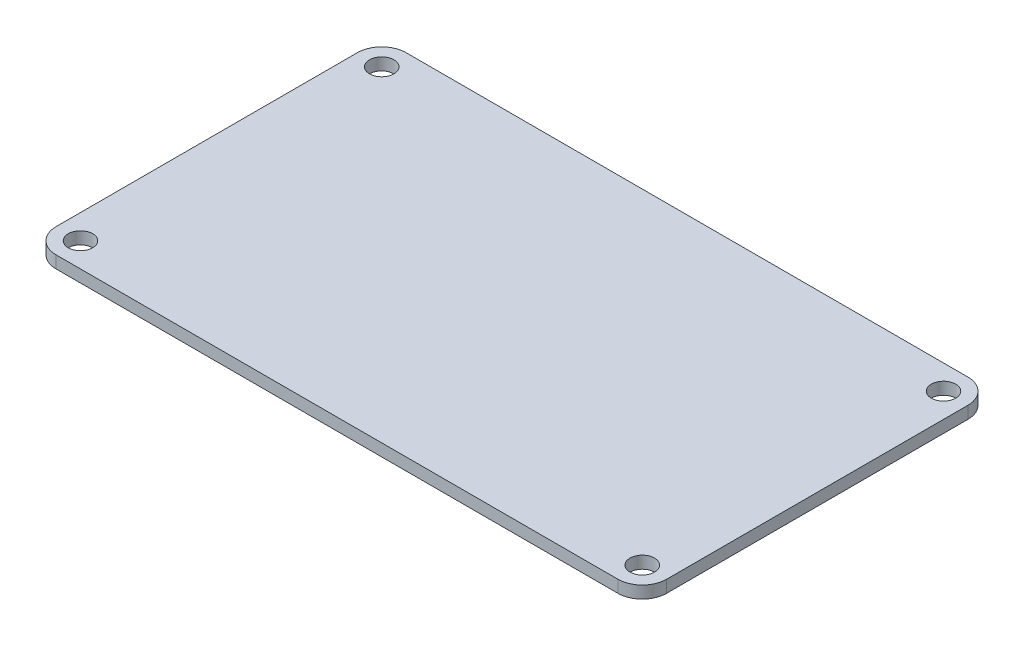
ISO-10303-21;
HEADER;
FILE_DESCRIPTION(('STEP AP214'),'2;1');
FILE_NAME('part.step','',(''),(''),'','','');
FILE_SCHEMA(('AUTOMOTIVE_DESIGN { 1 0 10303 214 1 1 1 1 }'));
ENDSEC;
DATA;
#1=APPLICATION_CONTEXT('core data for automotive mechanical design processes');
#2=APPLICATION_PROTOCOL_DEFINITION('international standard','automotive_design',2000,#1);
#3=PRODUCT_CONTEXT('',#1,'mechanical');
#4=PRODUCT('Part','Part','',(#3));
#5=PRODUCT_RELATED_PRODUCT_CATEGORY('part','',(#4));
#6=PRODUCT_DEFINITION_FORMATION('','',#4);
#7=PRODUCT_DEFINITION_CONTEXT('part definition',#1,'design');
#8=PRODUCT_DEFINITION('design','',#6,#7);
#9=PRODUCT_DEFINITION_SHAPE('','',#8);
#10=(LENGTH_UNIT() NAMED_UNIT(*) SI_UNIT(.MILLI.,.METRE.));
#11=(NAMED_UNIT(*) PLANE_ANGLE_UNIT() SI_UNIT($,.RADIAN.));
#12=(NAMED_UNIT(*) SI_UNIT($,.STERADIAN.) SOLID_ANGLE_UNIT());
#13=UNCERTAINTY_MEASURE_WITH_UNIT(LENGTH_MEASURE(1.E-05),#10,'distance_accuracy_value','');
#14=(GEOMETRIC_REPRESENTATION_CONTEXT(3) GLOBAL_UNCERTAINTY_ASSIGNED_CONTEXT((#13)) GLOBAL_UNIT_ASSIGNED_CONTEXT((#10,
#11,#12)) REPRESENTATION_CONTEXT('',''));
#15=CARTESIAN_POINT('',(0.,0.,0.));
#16=DIRECTION('',(0.,0.,1.));
#17=DIRECTION('',(1.,0.,0.));
#18=AXIS2_PLACEMENT_3D('',#15,#16,#17);
#19=CARTESIAN_POINT('',(34.5,1.5,18.5));
#20=DIRECTION('',(0.,1.,0.));
#21=DIRECTION('',(0.,0.,1.));
#22=AXIS2_PLACEMENT_3D('',#19,#20,#21);
#23=PLANE('',#22);
#24=CARTESIAN_POINT('',(-34.5,1.5,18.5));
#25=DIRECTION('',(0.,1.,0.));
#26=DIRECTION('',(0.,0.,1.));
#27=AXIS2_PLACEMENT_3D('',#24,#25,#26);
#28=CIRCLE('',#27,1.5);
#29=CARTESIAN_POINT('',(-34.5,1.5,20.));
#30=VERTEX_POINT('',#29);
#31=EDGE_CURVE('E191',#30,#30,#28,.T.);
#32=ORIENTED_EDGE('',*,*,#31,.F.);
#33=EDGE_LOOP('',(#32));
#34=FACE_BOUND('',#33,.T.);
#35=CARTESIAN_POINT('',(34.5,1.5,-18.5));
#36=DIRECTION('',(0.,1.,0.));
#37=DIRECTION('',(0.,0.,1.));
#38=AXIS2_PLACEMENT_3D('',#35,#36,#37);
#39=CIRCLE('',#38,1.5);
#40=CARTESIAN_POINT('',(34.5,1.5,-17.));
#41=VERTEX_POINT('',#40);
#42=EDGE_CURVE('E137',#41,#41,#39,.T.);
#43=ORIENTED_EDGE('',*,*,#42,.F.);
#44=EDGE_LOOP('',(#43));
#45=FACE_BOUND('',#44,.T.);
#46=CARTESIAN_POINT('',(34.5,1.5,18.5));
#47=DIRECTION('',(0.,1.,0.));
#48=DIRECTION('',(0.,0.,1.));
#49=AXIS2_PLACEMENT_3D('',#46,#47,#48);
#50=CIRCLE('',#49,3.);
#51=CARTESIAN_POINT('',(34.5,1.5,21.5));
#52=VERTEX_POINT('',#51);
#53=CARTESIAN_POINT('',(37.5,1.5,18.5));
#54=VERTEX_POINT('',#53);
#55=EDGE_CURVE('E148',#52,#54,#50,.T.);
#56=ORIENTED_EDGE('',*,*,#55,.T.);
#57=DIRECTION('',(0.,0.,-1.));
#58=VECTOR('',#57,1.);
#59=CARTESIAN_POINT('',(37.5,1.5,18.5));
#60=LINE('',#59,#58);
#61=CARTESIAN_POINT('',(37.5,1.5,-18.5));
#62=VERTEX_POINT('',#61);
#63=EDGE_CURVE('E96',#54,#62,#60,.T.);
#64=ORIENTED_EDGE('',*,*,#63,.T.);
#65=CARTESIAN_POINT('',(34.5,1.5,-18.5));
#66=DIRECTION('',(0.,1.,0.));
#67=DIRECTION('',(0.,0.,1.));
#68=AXIS2_PLACEMENT_3D('',#65,#66,#67);
#69=CIRCLE('',#68,3.);
#70=CARTESIAN_POINT('',(34.5,1.5,-21.5));
#71=VERTEX_POINT('',#70);
#72=EDGE_CURVE('E163',#62,#71,#69,.T.);
#73=ORIENTED_EDGE('',*,*,#72,.T.);
#74=DIRECTION('',(-1.,0.,0.));
#75=VECTOR('',#74,1.);
#76=CARTESIAN_POINT('',(34.5,1.5,-21.5));
#77=LINE('',#76,#75);
#78=CARTESIAN_POINT('',(-34.5,1.5,-21.5));
#79=VERTEX_POINT('',#78);
#80=EDGE_CURVE('E176',#71,#79,#77,.T.);
#81=ORIENTED_EDGE('',*,*,#80,.T.);
#82=CARTESIAN_POINT('',(-34.5,1.5,-18.5));
#83=DIRECTION('',(0.,1.,0.));
#84=DIRECTION('',(0.,0.,1.));
#85=AXIS2_PLACEMENT_3D('',#82,#83,#84);
#86=CIRCLE('',#85,3.);
#87=CARTESIAN_POINT('',(-37.5,1.5,-18.5));
#88=VERTEX_POINT('',#87);
#89=EDGE_CURVE('E115',#79,#88,#86,.T.);
#90=ORIENTED_EDGE('',*,*,#89,.T.);
#91=DIRECTION('',(0.,0.,1.));
#92=VECTOR('',#91,1.);
#93=CARTESIAN_POINT('',(-37.5,1.5,18.5));
#94=LINE('',#93,#92);
#95=CARTESIAN_POINT('',(-37.5,1.5,18.5));
#96=VERTEX_POINT('',#95);
#97=EDGE_CURVE('E109',#88,#96,#94,.T.);
#98=ORIENTED_EDGE('',*,*,#97,.T.);
#99=CARTESIAN_POINT('',(-34.5,1.5,18.5));
#100=DIRECTION('',(0.,1.,0.));
#101=DIRECTION('',(0.,0.,-1.));
#102=AXIS2_PLACEMENT_3D('',#99,#100,#101);
#103=CIRCLE('',#102,3.);
#104=CARTESIAN_POINT('',(-34.5,1.5,21.5));
#105=VERTEX_POINT('',#104);
#106=EDGE_CURVE('E113',#96,#105,#103,.T.);
#107=ORIENTED_EDGE('',*,*,#106,.T.);
#108=DIRECTION('',(1.,0.,0.));
#109=VECTOR('',#108,1.);
#110=CARTESIAN_POINT('',(34.5,1.5,21.5));
#111=LINE('',#110,#109);
#112=EDGE_CURVE('E53',#105,#52,#111,.T.);
#113=ORIENTED_EDGE('',*,*,#112,.T.);
#114=EDGE_LOOP('',(#56,#64,#73,#81,#90,#98,#107,#113));
#115=FACE_BOUND('',#114,.T.);
#116=CARTESIAN_POINT('',(-34.5,1.5,-18.5));
#117=DIRECTION('',(0.,1.,0.));
#118=DIRECTION('',(0.,0.,1.));
#119=AXIS2_PLACEMENT_3D('',#116,#117,#118);
#120=CIRCLE('',#119,1.5);
#121=CARTESIAN_POINT('',(-34.5,1.5,-17.));
#122=VERTEX_POINT('',#121);
#123=EDGE_CURVE('E185',#122,#122,#120,.T.);
#124=ORIENTED_EDGE('',*,*,#123,.F.);
#125=EDGE_LOOP('',(#124));
#126=FACE_BOUND('',#125,.T.);
#127=CARTESIAN_POINT('',(34.5,1.5,18.5));
#128=DIRECTION('',(0.,1.,0.));
#129=DIRECTION('',(0.,0.,1.));
#130=AXIS2_PLACEMENT_3D('',#127,#128,#129);
#131=CIRCLE('',#130,1.5);
#132=CARTESIAN_POINT('',(34.5,1.5,20.));
#133=VERTEX_POINT('',#132);
#134=EDGE_CURVE('E197',#133,#133,#131,.T.);
#135=ORIENTED_EDGE('',*,*,#134,.F.);
#136=EDGE_LOOP('',(#135));
#137=FACE_BOUND('',#136,.T.);
#138=ADVANCED_FACE('F36',(#34,#45,#115,#126,#137),#23,.T.);
#139=CARTESIAN_POINT('',(34.5,0.,18.5));
#140=DIRECTION('',(0.,1.,0.));
#141=DIRECTION('',(0.,0.,1.));
#142=AXIS2_PLACEMENT_3D('',#139,#140,#141);
#143=PLANE('',#142);
#144=CARTESIAN_POINT('',(34.5,0.,18.5));
#145=DIRECTION('',(0.,1.,0.));
#146=DIRECTION('',(0.,0.,1.));
#147=AXIS2_PLACEMENT_3D('',#144,#145,#146);
#148=CIRCLE('',#147,3.);
#149=CARTESIAN_POINT('',(34.5,0.,21.5));
#150=VERTEX_POINT('',#149);
#151=CARTESIAN_POINT('',(37.5,0.,18.5));
#152=VERTEX_POINT('',#151);
#153=EDGE_CURVE('E133',#150,#152,#148,.T.);
#154=ORIENTED_EDGE('',*,*,#153,.F.);
#155=DIRECTION('',(1.,0.,0.));
#156=VECTOR('',#155,1.);
#157=CARTESIAN_POINT('',(34.5,0.,21.5));
#158=LINE('',#157,#156);
#159=CARTESIAN_POINT('',(-34.5,0.,21.5));
#160=VERTEX_POINT('',#159);
#161=EDGE_CURVE('E88',#160,#150,#158,.T.);
#162=ORIENTED_EDGE('',*,*,#161,.F.);
#163=CARTESIAN_POINT('',(-34.5,0.,18.5));
#164=DIRECTION('',(0.,1.,0.));
#165=DIRECTION('',(0.,0.,-1.));
#166=AXIS2_PLACEMENT_3D('',#163,#164,#165);
#167=CIRCLE('',#166,3.);
#168=CARTESIAN_POINT('',(-37.5,0.,18.5));
#169=VERTEX_POINT('',#168);
#170=EDGE_CURVE('E82',#169,#160,#167,.T.);
#171=ORIENTED_EDGE('',*,*,#170,.F.);
#172=DIRECTION('',(0.,0.,1.));
#173=VECTOR('',#172,1.);
#174=CARTESIAN_POINT('',(-37.5,0.,18.5));
#175=LINE('',#174,#173);
#176=CARTESIAN_POINT('',(-37.5,0.,-18.5));
#177=VERTEX_POINT('',#176);
#178=EDGE_CURVE('E123',#177,#169,#175,.T.);
#179=ORIENTED_EDGE('',*,*,#178,.F.);
#180=CARTESIAN_POINT('',(-34.5,0.,-18.5));
#181=DIRECTION('',(0.,1.,0.));
#182=DIRECTION('',(0.,0.,1.));
#183=AXIS2_PLACEMENT_3D('',#180,#181,#182);
#184=CIRCLE('',#183,3.);
#185=CARTESIAN_POINT('',(-34.5,0.,-21.5));
#186=VERTEX_POINT('',#185);
#187=EDGE_CURVE('E143',#186,#177,#184,.T.);
#188=ORIENTED_EDGE('',*,*,#187,.F.);
#189=DIRECTION('',(-1.,0.,0.));
#190=VECTOR('',#189,1.);
#191=CARTESIAN_POINT('',(34.5,0.,-21.5));
#192=LINE('',#191,#190);
#193=CARTESIAN_POINT('',(34.5,0.,-21.5));
#194=VERTEX_POINT('',#193);
#195=EDGE_CURVE('E141',#194,#186,#192,.T.);
#196=ORIENTED_EDGE('',*,*,#195,.F.);
#197=CARTESIAN_POINT('',(34.5,0.,-18.5));
#198=DIRECTION('',(0.,1.,0.));
#199=DIRECTION('',(0.,0.,1.));
#200=AXIS2_PLACEMENT_3D('',#197,#198,#199);
#201=CIRCLE('',#200,3.);
#202=CARTESIAN_POINT('',(37.5,0.,-18.5));
#203=VERTEX_POINT('',#202);
#204=EDGE_CURVE('E139',#203,#194,#201,.T.);
#205=ORIENTED_EDGE('',*,*,#204,.F.);
#206=DIRECTION('',(0.,0.,-1.));
#207=VECTOR('',#206,1.);
#208=CARTESIAN_POINT('',(37.5,0.,18.5));
#209=LINE('',#208,#207);
#210=EDGE_CURVE('E136',#152,#203,#209,.T.);
#211=ORIENTED_EDGE('',*,*,#210,.F.);
#212=EDGE_LOOP('',(#154,#162,#171,#179,#188,#196,#205,#211));
#213=FACE_BOUND('',#212,.T.);
#214=CARTESIAN_POINT('',(34.5,0.,-18.5));
#215=DIRECTION('',(0.,1.,0.));
#216=DIRECTION('',(0.,0.,1.));
#217=AXIS2_PLACEMENT_3D('',#214,#215,#216);
#218=CIRCLE('',#217,1.5);
#219=CARTESIAN_POINT('',(34.5,0.,-17.));
#220=VERTEX_POINT('',#219);
#221=EDGE_CURVE('E182',#220,#220,#218,.T.);
#222=ORIENTED_EDGE('',*,*,#221,.T.);
#223=EDGE_LOOP('',(#222));
#224=FACE_BOUND('',#223,.T.);
#225=CARTESIAN_POINT('',(-34.5,0.,-18.5));
#226=DIRECTION('',(0.,1.,0.));
#227=DIRECTION('',(0.,0.,1.));
#228=AXIS2_PLACEMENT_3D('',#225,#226,#227);
#229=CIRCLE('',#228,1.5);
#230=CARTESIAN_POINT('',(-34.5,0.,-17.));
#231=VERTEX_POINT('',#230);
#232=EDGE_CURVE('E188',#231,#231,#229,.T.);
#233=ORIENTED_EDGE('',*,*,#232,.T.);
#234=EDGE_LOOP('',(#233));
#235=FACE_BOUND('',#234,.T.);
#236=CARTESIAN_POINT('',(-34.5,0.,18.5));
#237=DIRECTION('',(0.,1.,0.));
#238=DIRECTION('',(0.,0.,1.));
#239=AXIS2_PLACEMENT_3D('',#236,#237,#238);
#240=CIRCLE('',#239,1.5);
#241=CARTESIAN_POINT('',(-34.5,0.,20.));
#242=VERTEX_POINT('',#241);
#243=EDGE_CURVE('E194',#242,#242,#240,.T.);
#244=ORIENTED_EDGE('',*,*,#243,.T.);
#245=EDGE_LOOP('',(#244));
#246=FACE_BOUND('',#245,.T.);
#247=CARTESIAN_POINT('',(34.5,0.,18.5));
#248=DIRECTION('',(0.,1.,0.));
#249=DIRECTION('',(0.,0.,1.));
#250=AXIS2_PLACEMENT_3D('',#247,#248,#249);
#251=CIRCLE('',#250,1.5);
#252=CARTESIAN_POINT('',(34.5,0.,20.));
#253=VERTEX_POINT('',#252);
#254=EDGE_CURVE('E200',#253,#253,#251,.T.);
#255=ORIENTED_EDGE('',*,*,#254,.T.);
#256=EDGE_LOOP('',(#255));
#257=FACE_BOUND('',#256,.T.);
#258=ADVANCED_FACE('F167',(#213,#224,#235,#246,#257),#143,.F.);
#259=CARTESIAN_POINT('',(34.5,1.5,18.5));
#260=DIRECTION('',(0.,-1.,0.));
#261=DIRECTION('',(0.,0.,-1.));
#262=AXIS2_PLACEMENT_3D('',#259,#260,#261);
#263=CYLINDRICAL_SURFACE('',#262,3.);
#264=ORIENTED_EDGE('',*,*,#153,.T.);
#265=DIRECTION('',(0.,-1.,0.));
#266=VECTOR('',#265,1.);
#267=CARTESIAN_POINT('',(37.5,1.5,18.5));
#268=LINE('',#267,#266);
#269=EDGE_CURVE('E11',#54,#152,#268,.T.);
#270=ORIENTED_EDGE('',*,*,#269,.F.);
#271=ORIENTED_EDGE('',*,*,#55,.F.);
#272=DIRECTION('',(0.,-1.,0.));
#273=VECTOR('',#272,1.);
#274=CARTESIAN_POINT('',(34.5,1.5,21.5));
#275=LINE('',#274,#273);
#276=EDGE_CURVE('E129',#52,#150,#275,.T.);
#277=ORIENTED_EDGE('',*,*,#276,.T.);
#278=EDGE_LOOP('',(#264,#270,#271,#277));
#279=FACE_BOUND('',#278,.T.);
#280=ADVANCED_FACE('F38',(#279),#263,.T.);
#281=CARTESIAN_POINT('',(37.5,1.5,18.5));
#282=DIRECTION('',(-1.,0.,0.));
#283=DIRECTION('',(0.,0.,1.));
#284=AXIS2_PLACEMENT_3D('',#281,#282,#283);
#285=PLANE('',#284);
#286=ORIENTED_EDGE('',*,*,#210,.T.);
#287=DIRECTION('',(0.,-1.,0.));
#288=VECTOR('',#287,1.);
#289=CARTESIAN_POINT('',(37.5,1.5,-18.5));
#290=LINE('',#289,#288);
#291=EDGE_CURVE('E45',#62,#203,#290,.T.);
#292=ORIENTED_EDGE('',*,*,#291,.F.);
#293=ORIENTED_EDGE('',*,*,#63,.F.);
#294=ORIENTED_EDGE('',*,*,#269,.T.);
#295=EDGE_LOOP('',(#286,#292,#293,#294));
#296=FACE_BOUND('',#295,.T.);
#297=ADVANCED_FACE('F234',(#296),#285,.F.);
#298=CARTESIAN_POINT('',(34.5,1.5,-18.5));
#299=DIRECTION('',(0.,-1.,0.));
#300=DIRECTION('',(0.,0.,-1.));
#301=AXIS2_PLACEMENT_3D('',#298,#299,#300);
#302=CYLINDRICAL_SURFACE('',#301,3.);
#303=ORIENTED_EDGE('',*,*,#204,.T.);
#304=DIRECTION('',(0.,-1.,0.));
#305=VECTOR('',#304,1.);
#306=CARTESIAN_POINT('',(34.5,1.5,-21.5));
#307=LINE('',#306,#305);
#308=EDGE_CURVE('E155',#71,#194,#307,.T.);
#309=ORIENTED_EDGE('',*,*,#308,.F.);
#310=ORIENTED_EDGE('',*,*,#72,.F.);
#311=ORIENTED_EDGE('',*,*,#291,.T.);
#312=EDGE_LOOP('',(#303,#309,#310,#311));
#313=FACE_BOUND('',#312,.T.);
#314=ADVANCED_FACE('F161',(#313),#302,.T.);
#315=CARTESIAN_POINT('',(34.5,1.5,-21.5));
#316=DIRECTION('',(0.,0.,1.));
#317=DIRECTION('',(1.,0.,0.));
#318=AXIS2_PLACEMENT_3D('',#315,#316,#317);
#319=PLANE('',#318);
#320=ORIENTED_EDGE('',*,*,#195,.T.);
#321=DIRECTION('',(0.,-1.,0.));
#322=VECTOR('',#321,1.);
#323=CARTESIAN_POINT('',(-34.5,1.5,-21.5));
#324=LINE('',#323,#322);
#325=EDGE_CURVE('E152',#79,#186,#324,.T.);
#326=ORIENTED_EDGE('',*,*,#325,.F.);
#327=ORIENTED_EDGE('',*,*,#80,.F.);
#328=ORIENTED_EDGE('',*,*,#308,.T.);
#329=EDGE_LOOP('',(#320,#326,#327,#328));
#330=FACE_BOUND('',#329,.T.);
#331=ADVANCED_FACE('F172',(#330),#319,.F.);
#332=CARTESIAN_POINT('',(-34.5,1.5,-18.5));
#333=DIRECTION('',(0.,-1.,0.));
#334=DIRECTION('',(0.,0.,-1.));
#335=AXIS2_PLACEMENT_3D('',#332,#333,#334);
#336=CYLINDRICAL_SURFACE('',#335,3.);
#337=ORIENTED_EDGE('',*,*,#187,.T.);
#338=DIRECTION('',(0.,-1.,0.));
#339=VECTOR('',#338,1.);
#340=CARTESIAN_POINT('',(-37.5,1.5,-18.5));
#341=LINE('',#340,#339);
#342=EDGE_CURVE('E124',#88,#177,#341,.T.);
#343=ORIENTED_EDGE('',*,*,#342,.F.);
#344=ORIENTED_EDGE('',*,*,#89,.F.);
#345=ORIENTED_EDGE('',*,*,#325,.T.);
#346=EDGE_LOOP('',(#337,#343,#344,#345));
#347=FACE_BOUND('',#346,.T.);
#348=ADVANCED_FACE('F175',(#347),#336,.T.);
#349=CARTESIAN_POINT('',(-37.5,1.5,18.5));
#350=DIRECTION('',(1.,0.,0.));
#351=DIRECTION('',(0.,0.,-1.));
#352=AXIS2_PLACEMENT_3D('',#349,#350,#351);
#353=PLANE('',#352);
#354=ORIENTED_EDGE('',*,*,#178,.T.);
#355=DIRECTION('',(0.,-1.,0.));
#356=VECTOR('',#355,1.);
#357=CARTESIAN_POINT('',(-37.5,1.5,18.5));
#358=LINE('',#357,#356);
#359=EDGE_CURVE('E120',#96,#169,#358,.T.);
#360=ORIENTED_EDGE('',*,*,#359,.F.);
#361=ORIENTED_EDGE('',*,*,#97,.F.);
#362=ORIENTED_EDGE('',*,*,#342,.T.);
#363=EDGE_LOOP('',(#354,#360,#361,#362));
#364=FACE_BOUND('',#363,.T.);
#365=ADVANCED_FACE('F121',(#364),#353,.F.);
#366=CARTESIAN_POINT('',(-34.5,1.5,18.5));
#367=DIRECTION('',(0.,-1.,0.));
#368=DIRECTION('',(0.,0.,-1.));
#369=AXIS2_PLACEMENT_3D('',#366,#367,#368);
#370=CYLINDRICAL_SURFACE('',#369,3.);
#371=ORIENTED_EDGE('',*,*,#170,.T.);
#372=DIRECTION('',(0.,-1.,0.));
#373=VECTOR('',#372,1.);
#374=CARTESIAN_POINT('',(-34.5,1.5,21.5));
#375=LINE('',#374,#373);
#376=EDGE_CURVE('E125',#105,#160,#375,.T.);
#377=ORIENTED_EDGE('',*,*,#376,.F.);
#378=ORIENTED_EDGE('',*,*,#106,.F.);
#379=ORIENTED_EDGE('',*,*,#359,.T.);
#380=EDGE_LOOP('',(#371,#377,#378,#379));
#381=FACE_BOUND('',#380,.T.);
#382=ADVANCED_FACE('F127',(#381),#370,.T.);
#383=CARTESIAN_POINT('',(34.5,1.5,21.5));
#384=DIRECTION('',(0.,0.,-1.));
#385=DIRECTION('',(-1.,0.,0.));
#386=AXIS2_PLACEMENT_3D('',#383,#384,#385);
#387=PLANE('',#386);
#388=ORIENTED_EDGE('',*,*,#161,.T.);
#389=ORIENTED_EDGE('',*,*,#276,.F.);
#390=ORIENTED_EDGE('',*,*,#112,.F.);
#391=ORIENTED_EDGE('',*,*,#376,.T.);
#392=EDGE_LOOP('',(#388,#389,#390,#391));
#393=FACE_BOUND('',#392,.T.);
#394=ADVANCED_FACE('F222',(#393),#387,.F.);
#395=CARTESIAN_POINT('',(34.5,1.5,-18.5));
#396=DIRECTION('',(0.,-1.,0.));
#397=DIRECTION('',(0.,0.,-1.));
#398=AXIS2_PLACEMENT_3D('',#395,#396,#397);
#399=CYLINDRICAL_SURFACE('',#398,1.5);
#400=ORIENTED_EDGE('',*,*,#42,.T.);
#401=EDGE_LOOP('',(#400));
#402=FACE_BOUND('',#401,.T.);
#403=ORIENTED_EDGE('',*,*,#221,.F.);
#404=EDGE_LOOP('',(#403));
#405=FACE_BOUND('',#404,.T.);
#406=ADVANCED_FACE('F219',(#402,#405),#399,.F.);
#407=CARTESIAN_POINT('',(-34.5,1.5,-18.5));
#408=DIRECTION('',(0.,-1.,0.));
#409=DIRECTION('',(0.,0.,-1.));
#410=AXIS2_PLACEMENT_3D('',#407,#408,#409);
#411=CYLINDRICAL_SURFACE('',#410,1.5);
#412=ORIENTED_EDGE('',*,*,#123,.T.);
#413=EDGE_LOOP('',(#412));
#414=FACE_BOUND('',#413,.T.);
#415=ORIENTED_EDGE('',*,*,#232,.F.);
#416=EDGE_LOOP('',(#415));
#417=FACE_BOUND('',#416,.T.);
#418=ADVANCED_FACE('F298',(#414,#417),#411,.F.);
#419=CARTESIAN_POINT('',(-34.5,1.5,18.5));
#420=DIRECTION('',(0.,-1.,0.));
#421=DIRECTION('',(0.,0.,-1.));
#422=AXIS2_PLACEMENT_3D('',#419,#420,#421);
#423=CYLINDRICAL_SURFACE('',#422,1.5);
#424=ORIENTED_EDGE('',*,*,#31,.T.);
#425=EDGE_LOOP('',(#424));
#426=FACE_BOUND('',#425,.T.);
#427=ORIENTED_EDGE('',*,*,#243,.F.);
#428=EDGE_LOOP('',(#427));
#429=FACE_BOUND('',#428,.T.);
#430=ADVANCED_FACE('F306',(#426,#429),#423,.F.);
#431=CARTESIAN_POINT('',(34.5,1.5,18.5));
#432=DIRECTION('',(0.,-1.,0.));
#433=DIRECTION('',(0.,0.,-1.));
#434=AXIS2_PLACEMENT_3D('',#431,#432,#433);
#435=CYLINDRICAL_SURFACE('',#434,1.5);
#436=ORIENTED_EDGE('',*,*,#134,.T.);
#437=EDGE_LOOP('',(#436));
#438=FACE_BOUND('',#437,.T.);
#439=ORIENTED_EDGE('',*,*,#254,.F.);
#440=EDGE_LOOP('',(#439));
#441=FACE_BOUND('',#440,.T.);
#442=ADVANCED_FACE('F206',(#438,#441),#435,.F.);
#443=CLOSED_SHELL('',(#138,#258,#280,#297,#314,#331,#348,#365,#382,#394,#406,#418,#430,#442));
#444=MANIFOLD_SOLID_BREP('B2',#443);
#445=ADVANCED_BREP_SHAPE_REPRESENTATION('',(#18,#444),#14);
#446=SHAPE_DEFINITION_REPRESENTATION(#9,#445);
ENDSEC;
END-ISO-10303-21;
